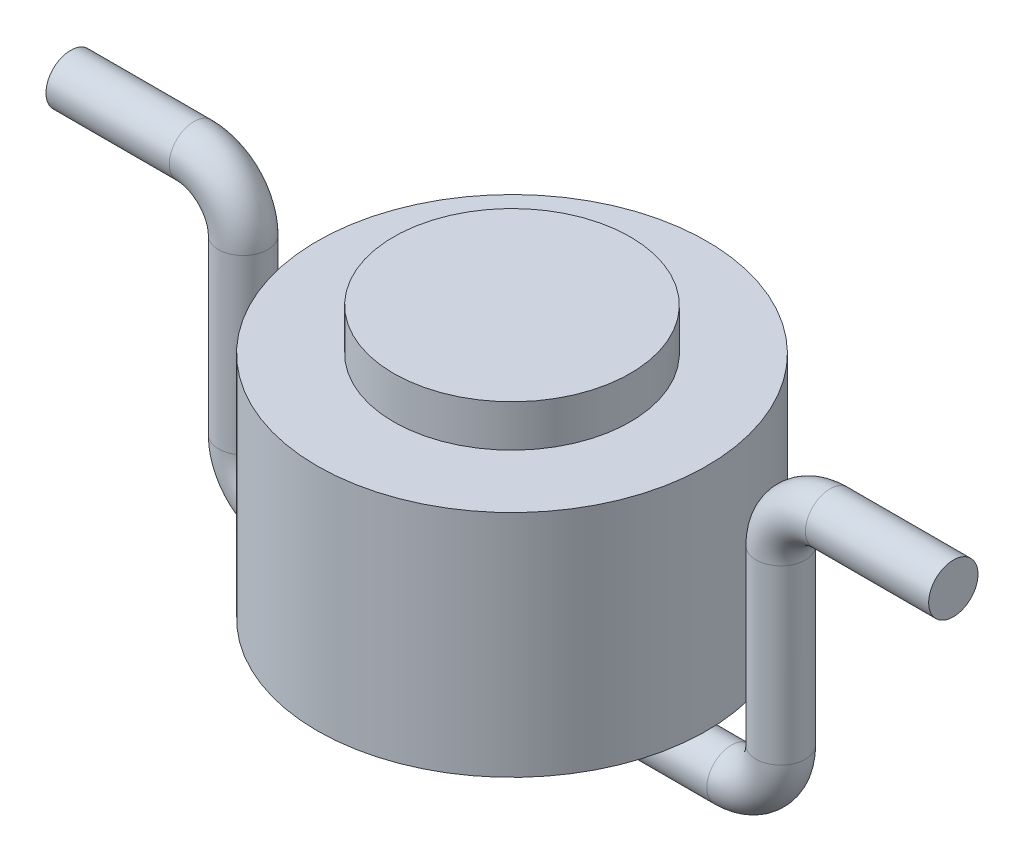
ISO-10303-21;
HEADER;
FILE_DESCRIPTION(('STEP AP214'),'2;1');
FILE_NAME('part.step','',(''),(''),'','','');
FILE_SCHEMA(('AUTOMOTIVE_DESIGN { 1 0 10303 214 1 1 1 1 }'));
ENDSEC;
DATA;
#1=APPLICATION_CONTEXT('core data for automotive mechanical design processes');
#2=APPLICATION_PROTOCOL_DEFINITION('international standard','automotive_design',2000,#1);
#3=PRODUCT_CONTEXT('',#1,'mechanical');
#4=PRODUCT('Part','Part','',(#3));
#5=PRODUCT_RELATED_PRODUCT_CATEGORY('part','',(#4));
#6=PRODUCT_DEFINITION_FORMATION('','',#4);
#7=PRODUCT_DEFINITION_CONTEXT('part definition',#1,'design');
#8=PRODUCT_DEFINITION('design','',#6,#7);
#9=PRODUCT_DEFINITION_SHAPE('','',#8);
#10=(LENGTH_UNIT() NAMED_UNIT(*) SI_UNIT(.MILLI.,.METRE.));
#11=(NAMED_UNIT(*) PLANE_ANGLE_UNIT() SI_UNIT($,.RADIAN.));
#12=(NAMED_UNIT(*) SI_UNIT($,.STERADIAN.) SOLID_ANGLE_UNIT());
#13=UNCERTAINTY_MEASURE_WITH_UNIT(LENGTH_MEASURE(1.E-05),#10,'distance_accuracy_value','');
#14=(GEOMETRIC_REPRESENTATION_CONTEXT(3) GLOBAL_UNCERTAINTY_ASSIGNED_CONTEXT((#13)) GLOBAL_UNIT_ASSIGNED_CONTEXT((#10,
#11,#12)) REPRESENTATION_CONTEXT('',''));
#15=CARTESIAN_POINT('',(0.,0.,0.));
#16=DIRECTION('',(0.,0.,1.));
#17=DIRECTION('',(1.,0.,0.));
#18=AXIS2_PLACEMENT_3D('',#15,#16,#17);
#19=CARTESIAN_POINT('',(-8.95,5.,0.));
#20=DIRECTION('',(1.,0.,0.));
#21=DIRECTION('',(0.,0.,-1.));
#22=AXIS2_PLACEMENT_3D('',#19,#20,#21);
#23=PLANE('',#22);
#24=CARTESIAN_POINT('',(-8.95,5.,0.));
#25=DIRECTION('',(1.,0.,0.));
#26=DIRECTION('',(0.,0.,-1.));
#27=AXIS2_PLACEMENT_3D('',#24,#25,#26);
#28=CIRCLE('',#27,0.5);
#29=CARTESIAN_POINT('',(-8.95,5.,-0.5));
#30=VERTEX_POINT('',#29);
#31=EDGE_CURVE('E56',#30,#30,#28,.T.);
#32=ORIENTED_EDGE('',*,*,#31,.F.);
#33=EDGE_LOOP('',(#32));
#34=FACE_BOUND('',#33,.T.);
#35=ADVANCED_FACE('F44',(#34),#23,.F.);
#36=CARTESIAN_POINT('',(8.95,5.,0.));
#37=DIRECTION('',(1.,0.,0.));
#38=DIRECTION('',(0.,0.,-1.));
#39=AXIS2_PLACEMENT_3D('',#36,#37,#38);
#40=PLANE('',#39);
#41=CARTESIAN_POINT('',(8.95,5.,0.));
#42=DIRECTION('',(1.,0.,0.));
#43=DIRECTION('',(0.,0.,-1.));
#44=AXIS2_PLACEMENT_3D('',#41,#42,#43);
#45=CIRCLE('',#44,0.5);
#46=CARTESIAN_POINT('',(8.95,5.,-0.5));
#47=VERTEX_POINT('',#46);
#48=EDGE_CURVE('E12',#47,#47,#45,.T.);
#49=ORIENTED_EDGE('',*,*,#48,.T.);
#50=EDGE_LOOP('',(#49));
#51=FACE_BOUND('',#50,.T.);
#52=ADVANCED_FACE('F59',(#51),#40,.T.);
#53=CARTESIAN_POINT('',(-8.95,5.,0.));
#54=DIRECTION('',(1.,0.,0.));
#55=DIRECTION('',(0.,0.,-1.));
#56=AXIS2_PLACEMENT_3D('',#53,#54,#55);
#57=CYLINDRICAL_SURFACE('',#56,0.5);
#58=CARTESIAN_POINT('',(-6.45000000000001,5.,0.));
#59=DIRECTION('',(1.,0.,0.));
#60=DIRECTION('',(0.,0.,-1.));
#61=AXIS2_PLACEMENT_3D('',#58,#59,#60);
#62=CIRCLE('',#61,0.5);
#63=CARTESIAN_POINT('',(-6.45000000000001,5.50000000000006,0.));
#64=VERTEX_POINT('',#63);
#65=EDGE_CURVE('E88',#64,#64,#62,.T.);
#66=ORIENTED_EDGE('',*,*,#65,.F.);
#67=EDGE_LOOP('',(#66));
#68=FACE_BOUND('',#67,.T.);
#69=ORIENTED_EDGE('',*,*,#31,.T.);
#70=EDGE_LOOP('',(#69));
#71=FACE_BOUND('',#70,.T.);
#72=ADVANCED_FACE('F92',(#68,#71),#57,.T.);
#73=CARTESIAN_POINT('',(-6.45,4.,0.));
#74=DIRECTION('',(0.,0.,-1.));
#75=DIRECTION('',(-1.,0.,0.));
#76=AXIS2_PLACEMENT_3D('',#73,#74,#75);
#77=TOROIDAL_SURFACE('',#76,1.00000000000006,0.5);
#78=CARTESIAN_POINT('',(-5.45,3.99999999999999,0.));
#79=DIRECTION('',(0.,-1.,0.));
#80=DIRECTION('',(0.,0.,-1.));
#81=AXIS2_PLACEMENT_3D('',#78,#79,#80);
#82=CIRCLE('',#81,0.5);
#83=CARTESIAN_POINT('',(-4.94999999999994,3.99999999999999,0.));
#84=VERTEX_POINT('',#83);
#85=EDGE_CURVE('E85',#84,#84,#82,.T.);
#86=CARTESIAN_POINT('',(-6.45,4.,0.));
#87=DIRECTION('',(0.,0.,-1.));
#88=DIRECTION('',(-1.,0.,0.));
#89=AXIS2_PLACEMENT_3D('',#86,#87,#88);
#90=CIRCLE('',#89,1.50000000000006);
#91=EDGE_CURVE('',#64,#84,#90,.T.);
#92=ORIENTED_EDGE('',*,*,#65,.T.);
#93=ORIENTED_EDGE('',*,*,#85,.F.);
#94=ORIENTED_EDGE('',*,*,#91,.T.);
#95=ORIENTED_EDGE('',*,*,#91,.F.);
#96=EDGE_LOOP('',(#92,#94,#93,#95));
#97=FACE_BOUND('',#96,.T.);
#98=ADVANCED_FACE('F94',(#97),#77,.T.);
#99=CARTESIAN_POINT('',(-5.45,3.99999999999999,0.));
#100=DIRECTION('',(0.,-1.,0.));
#101=DIRECTION('',(0.,0.,-1.));
#102=AXIS2_PLACEMENT_3D('',#99,#100,#101);
#103=CYLINDRICAL_SURFACE('',#102,0.5);
#104=CARTESIAN_POINT('',(-5.45,0.500000000000007,0.));
#105=DIRECTION('',(0.,-1.,0.));
#106=DIRECTION('',(0.,0.,-1.));
#107=AXIS2_PLACEMENT_3D('',#104,#105,#106);
#108=CIRCLE('',#107,0.5);
#109=CARTESIAN_POINT('',(-5.95,0.500000000000011,0.));
#110=VERTEX_POINT('',#109);
#111=EDGE_CURVE('E82',#110,#110,#108,.T.);
#112=ORIENTED_EDGE('',*,*,#111,.F.);
#113=EDGE_LOOP('',(#112));
#114=FACE_BOUND('',#113,.T.);
#115=ORIENTED_EDGE('',*,*,#85,.T.);
#116=EDGE_LOOP('',(#115));
#117=FACE_BOUND('',#116,.T.);
#118=ADVANCED_FACE('F101',(#114,#117),#103,.T.);
#119=CARTESIAN_POINT('',(-4.45,0.5,0.));
#120=DIRECTION('',(0.,0.,1.));
#121=DIRECTION('',(1.,0.,0.));
#122=AXIS2_PLACEMENT_3D('',#119,#120,#121);
#123=TOROIDAL_SURFACE('',#122,1.,0.5);
#124=CARTESIAN_POINT('',(-4.44999999999996,-0.499999999999938,0.));
#125=DIRECTION('',(1.,0.,0.));
#126=DIRECTION('',(0.,0.,-1.));
#127=AXIS2_PLACEMENT_3D('',#124,#125,#126);
#128=CIRCLE('',#127,0.5);
#129=CARTESIAN_POINT('',(-4.44999999999994,-1.,0.));
#130=VERTEX_POINT('',#129);
#131=EDGE_CURVE('E79',#130,#130,#128,.T.);
#132=CARTESIAN_POINT('',(-4.45,0.5,0.));
#133=DIRECTION('',(0.,0.,1.));
#134=DIRECTION('',(1.,0.,0.));
#135=AXIS2_PLACEMENT_3D('',#132,#133,#134);
#136=CIRCLE('',#135,1.5);
#137=EDGE_CURVE('',#110,#130,#136,.T.);
#138=ORIENTED_EDGE('',*,*,#111,.T.);
#139=ORIENTED_EDGE('',*,*,#131,.F.);
#140=ORIENTED_EDGE('',*,*,#137,.T.);
#141=ORIENTED_EDGE('',*,*,#137,.F.);
#142=EDGE_LOOP('',(#138,#140,#139,#141));
#143=FACE_BOUND('',#142,.T.);
#144=ADVANCED_FACE('F108',(#143),#123,.T.);
#145=CARTESIAN_POINT('',(-4.44999999999999,-0.5,0.));
#146=DIRECTION('',(1.,0.,0.));
#147=DIRECTION('',(0.,1.,0.));
#148=AXIS2_PLACEMENT_3D('',#145,#146,#147);
#149=CYLINDRICAL_SURFACE('',#148,0.5);
#150=CARTESIAN_POINT('',(4.44999999999999,-0.500000000000001,0.));
#151=DIRECTION('',(1.,0.,0.));
#152=DIRECTION('',(0.,0.,-1.));
#153=AXIS2_PLACEMENT_3D('',#150,#151,#152);
#154=CIRCLE('',#153,0.5);
#155=CARTESIAN_POINT('',(4.44999999999999,-1.00000000000006,0.));
#156=VERTEX_POINT('',#155);
#157=EDGE_CURVE('E76',#156,#156,#154,.T.);
#158=ORIENTED_EDGE('',*,*,#157,.F.);
#159=EDGE_LOOP('',(#158));
#160=FACE_BOUND('',#159,.T.);
#161=ORIENTED_EDGE('',*,*,#131,.T.);
#162=EDGE_LOOP('',(#161));
#163=FACE_BOUND('',#162,.T.);
#164=ADVANCED_FACE('F112',(#160,#163),#149,.T.);
#165=CARTESIAN_POINT('',(4.45,0.499999999999999,0.));
#166=DIRECTION('',(0.,0.,1.));
#167=DIRECTION('',(1.,0.,0.));
#168=AXIS2_PLACEMENT_3D('',#165,#166,#167);
#169=TOROIDAL_SURFACE('',#168,1.00000000000006,0.5);
#170=CARTESIAN_POINT('',(5.45,0.500000000000006,0.));
#171=DIRECTION('',(0.,1.,0.));
#172=DIRECTION('',(0.,0.,-1.));
#173=AXIS2_PLACEMENT_3D('',#170,#171,#172);
#174=CIRCLE('',#173,0.5);
#175=CARTESIAN_POINT('',(5.95000000000006,0.500000000000009,0.));
#176=VERTEX_POINT('',#175);
#177=EDGE_CURVE('E71',#176,#176,#174,.T.);
#178=CARTESIAN_POINT('',(4.45,0.499999999999999,0.));
#179=DIRECTION('',(0.,0.,1.));
#180=DIRECTION('',(1.,0.,0.));
#181=AXIS2_PLACEMENT_3D('',#178,#179,#180);
#182=CIRCLE('',#181,1.50000000000006);
#183=EDGE_CURVE('',#156,#176,#182,.T.);
#184=ORIENTED_EDGE('',*,*,#157,.T.);
#185=ORIENTED_EDGE('',*,*,#177,.F.);
#186=ORIENTED_EDGE('',*,*,#183,.T.);
#187=ORIENTED_EDGE('',*,*,#183,.F.);
#188=EDGE_LOOP('',(#184,#186,#185,#187));
#189=FACE_BOUND('',#188,.T.);
#190=ADVANCED_FACE('F116',(#189),#169,.T.);
#191=CARTESIAN_POINT('',(5.45,0.500000000000007,0.));
#192=DIRECTION('',(0.,1.,0.));
#193=DIRECTION('',(0.,0.,1.));
#194=AXIS2_PLACEMENT_3D('',#191,#192,#193);
#195=CYLINDRICAL_SURFACE('',#194,0.5);
#196=CARTESIAN_POINT('',(5.45,3.99999999999999,0.));
#197=DIRECTION('',(0.,1.,0.));
#198=DIRECTION('',(0.,0.,-1.));
#199=AXIS2_PLACEMENT_3D('',#196,#197,#198);
#200=CIRCLE('',#199,0.5);
#201=CARTESIAN_POINT('',(4.95,3.99999999999999,0.));
#202=VERTEX_POINT('',#201);
#203=EDGE_CURVE('E69',#202,#202,#200,.T.);
#204=ORIENTED_EDGE('',*,*,#203,.F.);
#205=EDGE_LOOP('',(#204));
#206=FACE_BOUND('',#205,.T.);
#207=ORIENTED_EDGE('',*,*,#177,.T.);
#208=EDGE_LOOP('',(#207));
#209=FACE_BOUND('',#208,.T.);
#210=ADVANCED_FACE('F120',(#206,#209),#195,.T.);
#211=CARTESIAN_POINT('',(6.45,4.,0.));
#212=DIRECTION('',(0.,0.,-1.));
#213=DIRECTION('',(-1.,0.,0.));
#214=AXIS2_PLACEMENT_3D('',#211,#212,#213);
#215=TOROIDAL_SURFACE('',#214,1.,0.5);
#216=CARTESIAN_POINT('',(6.44999999999997,4.99999999999994,0.));
#217=DIRECTION('',(1.,0.,0.));
#218=DIRECTION('',(0.,0.,-1.));
#219=AXIS2_PLACEMENT_3D('',#216,#217,#218);
#220=CIRCLE('',#219,0.5);
#221=CARTESIAN_POINT('',(6.44999999999996,5.5,0.));
#222=VERTEX_POINT('',#221);
#223=EDGE_CURVE('E51',#222,#222,#220,.T.);
#224=CARTESIAN_POINT('',(6.45,4.,0.));
#225=DIRECTION('',(0.,0.,-1.));
#226=DIRECTION('',(-1.,0.,0.));
#227=AXIS2_PLACEMENT_3D('',#224,#225,#226);
#228=CIRCLE('',#227,1.5);
#229=EDGE_CURVE('',#202,#222,#228,.T.);
#230=ORIENTED_EDGE('',*,*,#203,.T.);
#231=ORIENTED_EDGE('',*,*,#223,.F.);
#232=ORIENTED_EDGE('',*,*,#229,.T.);
#233=ORIENTED_EDGE('',*,*,#229,.F.);
#234=EDGE_LOOP('',(#230,#232,#231,#233));
#235=FACE_BOUND('',#234,.T.);
#236=ADVANCED_FACE('F64',(#235),#215,.T.);
#237=CARTESIAN_POINT('',(6.45000000000001,5.,0.));
#238=DIRECTION('',(1.,0.,0.));
#239=DIRECTION('',(0.,0.,-1.));
#240=AXIS2_PLACEMENT_3D('',#237,#238,#239);
#241=CYLINDRICAL_SURFACE('',#240,0.5);
#242=ORIENTED_EDGE('',*,*,#48,.F.);
#243=EDGE_LOOP('',(#242));
#244=FACE_BOUND('',#243,.T.);
#245=ORIENTED_EDGE('',*,*,#223,.T.);
#246=EDGE_LOOP('',(#245));
#247=FACE_BOUND('',#246,.T.);
#248=ADVANCED_FACE('F61',(#244,#247),#241,.T.);
#249=CLOSED_SHELL('',(#35,#52,#72,#98,#118,#144,#164,#190,#210,#236,#248));
#250=MANIFOLD_SOLID_BREP('B2',#249);
#251=CARTESIAN_POINT('',(0.,4.65,0.));
#252=DIRECTION('',(0.,-1.,0.));
#253=DIRECTION('',(0.,0.,-1.));
#254=AXIS2_PLACEMENT_3D('',#251,#252,#253);
#255=CYLINDRICAL_SURFACE('',#254,3.95);
#256=CARTESIAN_POINT('',(0.,4.65,0.));
#257=DIRECTION('',(0.,1.,0.));
#258=DIRECTION('',(0.,0.,1.));
#259=AXIS2_PLACEMENT_3D('',#256,#257,#258);
#260=CIRCLE('',#259,3.95);
#261=CARTESIAN_POINT('',(0.,4.65,3.95));
#262=VERTEX_POINT('',#261);
#263=EDGE_CURVE('E213',#262,#262,#260,.T.);
#264=ORIENTED_EDGE('',*,*,#263,.F.);
#265=EDGE_LOOP('',(#264));
#266=FACE_BOUND('',#265,.T.);
#267=CARTESIAN_POINT('',(0.,0.,0.));
#268=DIRECTION('',(0.,1.,0.));
#269=DIRECTION('',(0.,0.,1.));
#270=AXIS2_PLACEMENT_3D('',#267,#268,#269);
#271=CIRCLE('',#270,3.95);
#272=CARTESIAN_POINT('',(0.,0.,3.95));
#273=VERTEX_POINT('',#272);
#274=EDGE_CURVE('E209',#273,#273,#271,.T.);
#275=ORIENTED_EDGE('',*,*,#274,.T.);
#276=EDGE_LOOP('',(#275));
#277=FACE_BOUND('',#276,.T.);
#278=ADVANCED_FACE('F206',(#266,#277),#255,.T.);
#279=CARTESIAN_POINT('',(0.,4.65,0.));
#280=DIRECTION('',(0.,1.,0.));
#281=DIRECTION('',(0.,0.,1.));
#282=AXIS2_PLACEMENT_3D('',#279,#280,#281);
#283=PLANE('',#282);
#284=CARTESIAN_POINT('',(0.,4.65,0.));
#285=DIRECTION('',(0.,1.,0.));
#286=DIRECTION('',(0.,0.,1.));
#287=AXIS2_PLACEMENT_3D('',#284,#285,#286);
#288=CIRCLE('',#287,2.4);
#289=CARTESIAN_POINT('',(0.,4.65,2.4));
#290=VERTEX_POINT('',#289);
#291=EDGE_CURVE('E43',#290,#290,#288,.T.);
#292=ORIENTED_EDGE('',*,*,#291,.F.);
#293=EDGE_LOOP('',(#292));
#294=FACE_BOUND('',#293,.T.);
#295=ORIENTED_EDGE('',*,*,#263,.T.);
#296=EDGE_LOOP('',(#295));
#297=FACE_BOUND('',#296,.T.);
#298=ADVANCED_FACE('F230',(#294,#297),#283,.T.);
#299=CARTESIAN_POINT('',(0.,0.,0.));
#300=DIRECTION('',(0.,1.,0.));
#301=DIRECTION('',(0.,0.,1.));
#302=AXIS2_PLACEMENT_3D('',#299,#300,#301);
#303=PLANE('',#302);
#304=ORIENTED_EDGE('',*,*,#274,.F.);
#305=EDGE_LOOP('',(#304));
#306=FACE_BOUND('',#305,.T.);
#307=ADVANCED_FACE('F227',(#306),#303,.F.);
#308=CARTESIAN_POINT('',(0.,5.5,0.));
#309=DIRECTION('',(0.,-1.,0.));
#310=DIRECTION('',(0.,0.,-1.));
#311=AXIS2_PLACEMENT_3D('',#308,#309,#310);
#312=CYLINDRICAL_SURFACE('',#311,2.4);
#313=CARTESIAN_POINT('',(0.,5.5,0.));
#314=DIRECTION('',(0.,1.,0.));
#315=DIRECTION('',(0.,0.,1.));
#316=AXIS2_PLACEMENT_3D('',#313,#314,#315);
#317=CIRCLE('',#316,2.4);
#318=CARTESIAN_POINT('',(0.,5.5,2.4));
#319=VERTEX_POINT('',#318);
#320=EDGE_CURVE('E219',#319,#319,#317,.T.);
#321=ORIENTED_EDGE('',*,*,#320,.F.);
#322=EDGE_LOOP('',(#321));
#323=FACE_BOUND('',#322,.T.);
#324=ORIENTED_EDGE('',*,*,#291,.T.);
#325=EDGE_LOOP('',(#324));
#326=FACE_BOUND('',#325,.T.);
#327=ADVANCED_FACE('F229',(#323,#326),#312,.T.);
#328=CARTESIAN_POINT('',(0.,5.5,0.));
#329=DIRECTION('',(0.,1.,0.));
#330=DIRECTION('',(0.,0.,1.));
#331=AXIS2_PLACEMENT_3D('',#328,#329,#330);
#332=PLANE('',#331);
#333=ORIENTED_EDGE('',*,*,#320,.T.);
#334=EDGE_LOOP('',(#333));
#335=FACE_BOUND('',#334,.T.);
#336=ADVANCED_FACE('F235',(#335),#332,.T.);
#337=CLOSED_SHELL('',(#278,#298,#307,#327,#336));
#338=MANIFOLD_SOLID_BREP('B6',#337);
#339=ADVANCED_BREP_SHAPE_REPRESENTATION('',(#18,#250,#338),#14);
#340=SHAPE_DEFINITION_REPRESENTATION(#9,#339);
ENDSEC;
END-ISO-10303-21;
